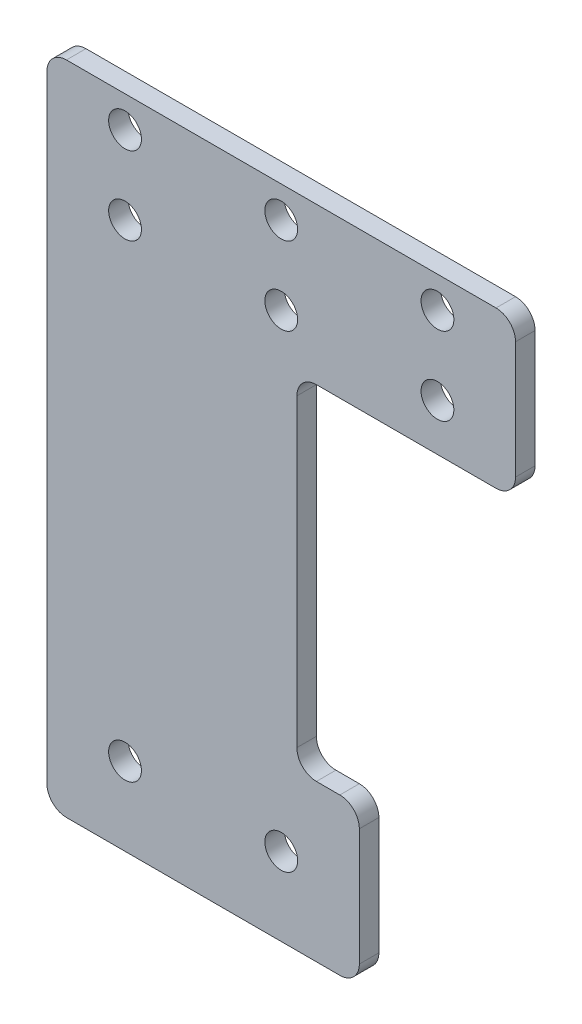
ISO-10303-21;
HEADER;
FILE_DESCRIPTION(('STEP AP214'),'2;1');
FILE_NAME('part.step','',(''),(''),'','','');
FILE_SCHEMA(('AUTOMOTIVE_DESIGN { 1 0 10303 214 1 1 1 1 }'));
ENDSEC;
DATA;
#1=APPLICATION_CONTEXT('core data for automotive mechanical design processes');
#2=APPLICATION_PROTOCOL_DEFINITION('international standard','automotive_design',2000,#1);
#3=PRODUCT_CONTEXT('',#1,'mechanical');
#4=PRODUCT('Part','Part','',(#3));
#5=PRODUCT_RELATED_PRODUCT_CATEGORY('part','',(#4));
#6=PRODUCT_DEFINITION_FORMATION('','',#4);
#7=PRODUCT_DEFINITION_CONTEXT('part definition',#1,'design');
#8=PRODUCT_DEFINITION('design','',#6,#7);
#9=PRODUCT_DEFINITION_SHAPE('','',#8);
#10=(LENGTH_UNIT() NAMED_UNIT(*) SI_UNIT(.MILLI.,.METRE.));
#11=(NAMED_UNIT(*) PLANE_ANGLE_UNIT() SI_UNIT($,.RADIAN.));
#12=(NAMED_UNIT(*) SI_UNIT($,.STERADIAN.) SOLID_ANGLE_UNIT());
#13=UNCERTAINTY_MEASURE_WITH_UNIT(LENGTH_MEASURE(1.E-05),#10,'distance_accuracy_value','');
#14=(GEOMETRIC_REPRESENTATION_CONTEXT(3) GLOBAL_UNCERTAINTY_ASSIGNED_CONTEXT((#13)) GLOBAL_UNIT_ASSIGNED_CONTEXT((#10,
#11,#12)) REPRESENTATION_CONTEXT('',''));
#15=CARTESIAN_POINT('',(0.,0.,0.));
#16=DIRECTION('',(0.,0.,1.));
#17=DIRECTION('',(1.,0.,0.));
#18=AXIS2_PLACEMENT_3D('',#15,#16,#17);
#19=CARTESIAN_POINT('',(0.,25.4,3.175));
#20=DIRECTION('',(0.,1.,0.));
#21=DIRECTION('',(0.,0.,1.));
#22=AXIS2_PLACEMENT_3D('',#19,#20,#21);
#23=PLANE('',#22);
#24=DIRECTION('',(1.,0.,0.));
#25=VECTOR('',#24,1.);
#26=CARTESIAN_POINT('',(0.,25.4,0.));
#27=LINE('',#26,#25);
#28=CARTESIAN_POINT('',(43.815,25.4,0.));
#29=VERTEX_POINT('',#28);
#30=CARTESIAN_POINT('',(47.625,25.4,0.));
#31=VERTEX_POINT('',#30);
#32=EDGE_CURVE('E162',#29,#31,#27,.T.);
#33=ORIENTED_EDGE('',*,*,#32,.F.);
#34=DIRECTION('',(0.,0.,-1.));
#35=VECTOR('',#34,1.);
#36=CARTESIAN_POINT('',(43.815,25.4,3.175));
#37=LINE('',#36,#35);
#38=CARTESIAN_POINT('',(43.815,25.4,3.175));
#39=VERTEX_POINT('',#38);
#40=EDGE_CURVE('E243',#29,#39,#37,.F.);
#41=ORIENTED_EDGE('',*,*,#40,.T.);
#42=DIRECTION('',(1.,0.,0.));
#43=VECTOR('',#42,1.);
#44=CARTESIAN_POINT('',(0.,25.4,3.175));
#45=LINE('',#44,#43);
#46=CARTESIAN_POINT('',(47.625,25.4,3.175));
#47=VERTEX_POINT('',#46);
#48=EDGE_CURVE('E316',#39,#47,#45,.T.);
#49=ORIENTED_EDGE('',*,*,#48,.T.);
#50=DIRECTION('',(0.,0.,-1.));
#51=VECTOR('',#50,1.);
#52=CARTESIAN_POINT('',(47.625,25.4,3.175));
#53=LINE('',#52,#51);
#54=EDGE_CURVE('E240',#47,#31,#53,.T.);
#55=ORIENTED_EDGE('',*,*,#54,.T.);
#56=EDGE_LOOP('',(#33,#41,#49,#55));
#57=FACE_BOUND('',#56,.T.);
#58=ADVANCED_FACE('F41',(#57),#23,.T.);
#59=CARTESIAN_POINT('',(40.64,0.,3.175));
#60=DIRECTION('',(1.,0.,0.));
#61=DIRECTION('',(0.,1.,0.));
#62=AXIS2_PLACEMENT_3D('',#59,#60,#61);
#63=PLANE('',#62);
#64=DIRECTION('',(0.,-1.,0.));
#65=VECTOR('',#64,1.);
#66=CARTESIAN_POINT('',(40.64,0.,3.175));
#67=LINE('',#66,#65);
#68=CARTESIAN_POINT('',(40.64,78.105,3.175));
#69=VERTEX_POINT('',#68);
#70=CARTESIAN_POINT('',(40.64,28.575,3.175));
#71=VERTEX_POINT('',#70);
#72=EDGE_CURVE('E304',#69,#71,#67,.T.);
#73=ORIENTED_EDGE('',*,*,#72,.T.);
#74=DIRECTION('',(0.,0.,-1.));
#75=VECTOR('',#74,1.);
#76=CARTESIAN_POINT('',(40.64,28.575,0.));
#77=LINE('',#76,#75);
#78=CARTESIAN_POINT('',(40.64,28.575,0.));
#79=VERTEX_POINT('',#78);
#80=EDGE_CURVE('E236',#71,#79,#77,.T.);
#81=ORIENTED_EDGE('',*,*,#80,.T.);
#82=DIRECTION('',(0.,-1.,0.));
#83=VECTOR('',#82,1.);
#84=CARTESIAN_POINT('',(40.64,0.,0.));
#85=LINE('',#84,#83);
#86=CARTESIAN_POINT('',(40.64,78.105,0.));
#87=VERTEX_POINT('',#86);
#88=EDGE_CURVE('E282',#87,#79,#85,.T.);
#89=ORIENTED_EDGE('',*,*,#88,.F.);
#90=DIRECTION('',(0.,0.,-1.));
#91=VECTOR('',#90,1.);
#92=CARTESIAN_POINT('',(40.64,78.105,3.175));
#93=LINE('',#92,#91);
#94=EDGE_CURVE('E233',#87,#69,#93,.F.);
#95=ORIENTED_EDGE('',*,*,#94,.T.);
#96=EDGE_LOOP('',(#73,#81,#89,#95));
#97=FACE_BOUND('',#96,.T.);
#98=ADVANCED_FACE('F290',(#97),#63,.T.);
#99=CARTESIAN_POINT('',(0.,81.28,3.175));
#100=DIRECTION('',(0.,-1.,0.));
#101=DIRECTION('',(0.,0.,-1.));
#102=AXIS2_PLACEMENT_3D('',#99,#100,#101);
#103=PLANE('',#102);
#104=DIRECTION('',(-1.,0.,0.));
#105=VECTOR('',#104,1.);
#106=CARTESIAN_POINT('',(0.,81.28,3.175));
#107=LINE('',#106,#105);
#108=CARTESIAN_POINT('',(73.025,81.28,3.175));
#109=VERTEX_POINT('',#108);
#110=CARTESIAN_POINT('',(43.815,81.28,3.175));
#111=VERTEX_POINT('',#110);
#112=EDGE_CURVE('E302',#109,#111,#107,.T.);
#113=ORIENTED_EDGE('',*,*,#112,.T.);
#114=DIRECTION('',(0.,0.,-1.));
#115=VECTOR('',#114,1.);
#116=CARTESIAN_POINT('',(43.815,81.28,0.));
#117=LINE('',#116,#115);
#118=CARTESIAN_POINT('',(43.815,81.28,0.));
#119=VERTEX_POINT('',#118);
#120=EDGE_CURVE('E249',#111,#119,#117,.T.);
#121=ORIENTED_EDGE('',*,*,#120,.T.);
#122=DIRECTION('',(-1.,0.,0.));
#123=VECTOR('',#122,1.);
#124=CARTESIAN_POINT('',(0.,81.28,0.));
#125=LINE('',#124,#123);
#126=CARTESIAN_POINT('',(73.025,81.28,0.));
#127=VERTEX_POINT('',#126);
#128=EDGE_CURVE('E284',#127,#119,#125,.T.);
#129=ORIENTED_EDGE('',*,*,#128,.F.);
#130=DIRECTION('',(0.,0.,-1.));
#131=VECTOR('',#130,1.);
#132=CARTESIAN_POINT('',(73.025,81.28,3.175));
#133=LINE('',#132,#131);
#134=EDGE_CURVE('E246',#127,#109,#133,.F.);
#135=ORIENTED_EDGE('',*,*,#134,.T.);
#136=EDGE_LOOP('',(#113,#121,#129,#135));
#137=FACE_BOUND('',#136,.T.);
#138=ADVANCED_FACE('F306',(#137),#103,.T.);
#139=CARTESIAN_POINT('',(76.2,0.,3.175));
#140=DIRECTION('',(1.,0.,0.));
#141=DIRECTION('',(0.,0.,-1.));
#142=AXIS2_PLACEMENT_3D('',#139,#140,#141);
#143=PLANE('',#142);
#144=DIRECTION('',(0.,-1.,0.));
#145=VECTOR('',#144,1.);
#146=CARTESIAN_POINT('',(76.2,0.,0.));
#147=LINE('',#146,#145);
#148=CARTESIAN_POINT('',(76.2,103.505,0.));
#149=VERTEX_POINT('',#148);
#150=CARTESIAN_POINT('',(76.2,84.455,0.));
#151=VERTEX_POINT('',#150);
#152=EDGE_CURVE('E364',#149,#151,#147,.T.);
#153=ORIENTED_EDGE('',*,*,#152,.F.);
#154=DIRECTION('',(0.,0.,-1.));
#155=VECTOR('',#154,1.);
#156=CARTESIAN_POINT('',(76.2,103.505,3.175));
#157=LINE('',#156,#155);
#158=CARTESIAN_POINT('',(76.2,103.505,3.175));
#159=VERTEX_POINT('',#158);
#160=EDGE_CURVE('E270',#149,#159,#157,.F.);
#161=ORIENTED_EDGE('',*,*,#160,.T.);
#162=DIRECTION('',(0.,-1.,0.));
#163=VECTOR('',#162,1.);
#164=CARTESIAN_POINT('',(76.2,0.,3.175));
#165=LINE('',#164,#163);
#166=CARTESIAN_POINT('',(76.2,84.455,3.175));
#167=VERTEX_POINT('',#166);
#168=EDGE_CURVE('E309',#159,#167,#165,.T.);
#169=ORIENTED_EDGE('',*,*,#168,.T.);
#170=DIRECTION('',(0.,0.,-1.));
#171=VECTOR('',#170,1.);
#172=CARTESIAN_POINT('',(76.2,84.455,3.175));
#173=LINE('',#172,#171);
#174=EDGE_CURVE('E266',#167,#151,#173,.T.);
#175=ORIENTED_EDGE('',*,*,#174,.T.);
#176=EDGE_LOOP('',(#153,#161,#169,#175));
#177=FACE_BOUND('',#176,.T.);
#178=ADVANCED_FACE('F463',(#177),#143,.T.);
#179=CARTESIAN_POINT('',(0.,106.68,3.175));
#180=DIRECTION('',(0.,1.,0.));
#181=DIRECTION('',(0.,0.,1.));
#182=AXIS2_PLACEMENT_3D('',#179,#180,#181);
#183=PLANE('',#182);
#184=DIRECTION('',(1.,0.,0.));
#185=VECTOR('',#184,1.);
#186=CARTESIAN_POINT('',(0.,106.68,0.));
#187=LINE('',#186,#185);
#188=CARTESIAN_POINT('',(3.175,106.68,0.));
#189=VERTEX_POINT('',#188);
#190=CARTESIAN_POINT('',(73.025,106.68,0.));
#191=VERTEX_POINT('',#190);
#192=EDGE_CURVE('E368',#189,#191,#187,.T.);
#193=ORIENTED_EDGE('',*,*,#192,.F.);
#194=DIRECTION('',(0.,0.,-1.));
#195=VECTOR('',#194,1.);
#196=CARTESIAN_POINT('',(3.175,106.68,3.175));
#197=LINE('',#196,#195);
#198=CARTESIAN_POINT('',(3.175,106.68,3.175));
#199=VERTEX_POINT('',#198);
#200=EDGE_CURVE('E263',#189,#199,#197,.F.);
#201=ORIENTED_EDGE('',*,*,#200,.T.);
#202=DIRECTION('',(1.,0.,0.));
#203=VECTOR('',#202,1.);
#204=CARTESIAN_POINT('',(0.,106.68,3.175));
#205=LINE('',#204,#203);
#206=CARTESIAN_POINT('',(73.025,106.68,3.175));
#207=VERTEX_POINT('',#206);
#208=EDGE_CURVE('E314',#199,#207,#205,.T.);
#209=ORIENTED_EDGE('',*,*,#208,.T.);
#210=DIRECTION('',(0.,0.,-1.));
#211=VECTOR('',#210,1.);
#212=CARTESIAN_POINT('',(73.025,106.68,3.175));
#213=LINE('',#212,#211);
#214=EDGE_CURVE('E259',#207,#191,#213,.T.);
#215=ORIENTED_EDGE('',*,*,#214,.T.);
#216=EDGE_LOOP('',(#193,#201,#209,#215));
#217=FACE_BOUND('',#216,.T.);
#218=ADVANCED_FACE('F457',(#217),#183,.T.);
#219=CARTESIAN_POINT('',(0.,0.,3.175));
#220=DIRECTION('',(-1.,0.,0.));
#221=DIRECTION('',(0.,0.,1.));
#222=AXIS2_PLACEMENT_3D('',#219,#220,#221);
#223=PLANE('',#222);
#224=DIRECTION('',(0.,1.,0.));
#225=VECTOR('',#224,1.);
#226=CARTESIAN_POINT('',(0.,0.,3.175));
#227=LINE('',#226,#225);
#228=CARTESIAN_POINT('',(0.,3.175,3.175));
#229=VERTEX_POINT('',#228);
#230=CARTESIAN_POINT('',(0.,103.505,3.175));
#231=VERTEX_POINT('',#230);
#232=EDGE_CURVE('E323',#229,#231,#227,.T.);
#233=ORIENTED_EDGE('',*,*,#232,.T.);
#234=DIRECTION('',(0.,0.,-1.));
#235=VECTOR('',#234,1.);
#236=CARTESIAN_POINT('',(0.,103.505,3.175));
#237=LINE('',#236,#235);
#238=CARTESIAN_POINT('',(0.,103.505,0.));
#239=VERTEX_POINT('',#238);
#240=EDGE_CURVE('E255',#231,#239,#237,.T.);
#241=ORIENTED_EDGE('',*,*,#240,.T.);
#242=DIRECTION('',(0.,1.,0.));
#243=VECTOR('',#242,1.);
#244=CARTESIAN_POINT('',(0.,0.,0.));
#245=LINE('',#244,#243);
#246=CARTESIAN_POINT('',(0.,3.175,0.));
#247=VERTEX_POINT('',#246);
#248=EDGE_CURVE('E372',#247,#239,#245,.T.);
#249=ORIENTED_EDGE('',*,*,#248,.F.);
#250=DIRECTION('',(0.,0.,-1.));
#251=VECTOR('',#250,1.);
#252=CARTESIAN_POINT('',(0.,3.175,3.175));
#253=LINE('',#252,#251);
#254=EDGE_CURVE('E64',#247,#229,#253,.F.);
#255=ORIENTED_EDGE('',*,*,#254,.T.);
#256=EDGE_LOOP('',(#233,#241,#249,#255));
#257=FACE_BOUND('',#256,.T.);
#258=ADVANCED_FACE('F460',(#257),#223,.T.);
#259=CARTESIAN_POINT('',(0.,0.,3.175));
#260=DIRECTION('',(0.,-1.,0.));
#261=DIRECTION('',(1.,0.,0.));
#262=AXIS2_PLACEMENT_3D('',#259,#260,#261);
#263=PLANE('',#262);
#264=DIRECTION('',(-1.,0.,0.));
#265=VECTOR('',#264,1.);
#266=CARTESIAN_POINT('',(0.,0.,0.));
#267=LINE('',#266,#265);
#268=CARTESIAN_POINT('',(47.625,0.,0.));
#269=VERTEX_POINT('',#268);
#270=CARTESIAN_POINT('',(3.175,0.,0.));
#271=VERTEX_POINT('',#270);
#272=EDGE_CURVE('E181',#269,#271,#267,.T.);
#273=ORIENTED_EDGE('',*,*,#272,.F.);
#274=DIRECTION('',(0.,0.,-1.));
#275=VECTOR('',#274,1.);
#276=CARTESIAN_POINT('',(47.625,0.,3.175));
#277=LINE('',#276,#275);
#278=CARTESIAN_POINT('',(47.625,0.,3.175));
#279=VERTEX_POINT('',#278);
#280=EDGE_CURVE('E214',#269,#279,#277,.F.);
#281=ORIENTED_EDGE('',*,*,#280,.T.);
#282=DIRECTION('',(-1.,0.,0.));
#283=VECTOR('',#282,1.);
#284=CARTESIAN_POINT('',(0.,0.,3.175));
#285=LINE('',#284,#283);
#286=CARTESIAN_POINT('',(3.175,0.,3.175));
#287=VERTEX_POINT('',#286);
#288=EDGE_CURVE('E326',#279,#287,#285,.T.);
#289=ORIENTED_EDGE('',*,*,#288,.T.);
#290=DIRECTION('',(0.,0.,-1.));
#291=VECTOR('',#290,1.);
#292=CARTESIAN_POINT('',(3.175,0.,3.175));
#293=LINE('',#292,#291);
#294=EDGE_CURVE('E210',#287,#271,#293,.T.);
#295=ORIENTED_EDGE('',*,*,#294,.T.);
#296=EDGE_LOOP('',(#273,#281,#289,#295));
#297=FACE_BOUND('',#296,.T.);
#298=ADVANCED_FACE('F381',(#297),#263,.T.);
#299=CARTESIAN_POINT('',(50.8,0.,3.175));
#300=DIRECTION('',(1.,0.,0.));
#301=DIRECTION('',(0.,1.,0.));
#302=AXIS2_PLACEMENT_3D('',#299,#300,#301);
#303=PLANE('',#302);
#304=DIRECTION('',(0.,-1.,0.));
#305=VECTOR('',#304,1.);
#306=CARTESIAN_POINT('',(50.8,0.,3.175));
#307=LINE('',#306,#305);
#308=CARTESIAN_POINT('',(50.8,22.225,3.175));
#309=VERTEX_POINT('',#308);
#310=CARTESIAN_POINT('',(50.8,3.175,3.175));
#311=VERTEX_POINT('',#310);
#312=EDGE_CURVE('E194',#309,#311,#307,.T.);
#313=ORIENTED_EDGE('',*,*,#312,.T.);
#314=DIRECTION('',(0.,0.,-1.));
#315=VECTOR('',#314,1.);
#316=CARTESIAN_POINT('',(50.8,3.175,3.175));
#317=LINE('',#316,#315);
#318=CARTESIAN_POINT('',(50.8,3.175,0.));
#319=VERTEX_POINT('',#318);
#320=EDGE_CURVE('E178',#311,#319,#317,.T.);
#321=ORIENTED_EDGE('',*,*,#320,.T.);
#322=DIRECTION('',(0.,-1.,0.));
#323=VECTOR('',#322,1.);
#324=CARTESIAN_POINT('',(50.8,0.,0.));
#325=LINE('',#324,#323);
#326=CARTESIAN_POINT('',(50.8,22.225,0.));
#327=VERTEX_POINT('',#326);
#328=EDGE_CURVE('E160',#327,#319,#325,.T.);
#329=ORIENTED_EDGE('',*,*,#328,.F.);
#330=DIRECTION('',(0.,0.,-1.));
#331=VECTOR('',#330,1.);
#332=CARTESIAN_POINT('',(50.8,22.225,3.175));
#333=LINE('',#332,#331);
#334=EDGE_CURVE('E175',#327,#309,#333,.F.);
#335=ORIENTED_EDGE('',*,*,#334,.T.);
#336=EDGE_LOOP('',(#313,#321,#329,#335));
#337=FACE_BOUND('',#336,.T.);
#338=ADVANCED_FACE('F174',(#337),#303,.T.);
#339=CARTESIAN_POINT('',(12.7,88.9,3.175));
#340=DIRECTION('',(0.,0.,-1.));
#341=DIRECTION('',(-1.,0.,0.));
#342=AXIS2_PLACEMENT_3D('',#339,#340,#341);
#343=CYLINDRICAL_SURFACE('',#342,2.667);
#344=CARTESIAN_POINT('',(12.7,88.9,3.175));
#345=DIRECTION('',(0.,0.,1.));
#346=DIRECTION('',(1.,0.,0.));
#347=AXIS2_PLACEMENT_3D('',#344,#345,#346);
#348=CIRCLE('',#347,2.667);
#349=CARTESIAN_POINT('',(15.367,88.9,3.175));
#350=VERTEX_POINT('',#349);
#351=EDGE_CURVE('E515',#350,#350,#348,.T.);
#352=ORIENTED_EDGE('',*,*,#351,.T.);
#353=EDGE_LOOP('',(#352));
#354=FACE_BOUND('',#353,.T.);
#355=CARTESIAN_POINT('',(12.7,88.9,0.));
#356=DIRECTION('',(0.,0.,1.));
#357=DIRECTION('',(1.,0.,0.));
#358=AXIS2_PLACEMENT_3D('',#355,#356,#357);
#359=CIRCLE('',#358,2.667);
#360=CARTESIAN_POINT('',(15.367,88.9,0.));
#361=VERTEX_POINT('',#360);
#362=EDGE_CURVE('E356',#361,#361,#359,.T.);
#363=ORIENTED_EDGE('',*,*,#362,.F.);
#364=EDGE_LOOP('',(#363));
#365=FACE_BOUND('',#364,.T.);
#366=ADVANCED_FACE('F404',(#354,#365),#343,.F.);
#367=CARTESIAN_POINT('',(38.1,88.9,3.175));
#368=DIRECTION('',(0.,0.,-1.));
#369=DIRECTION('',(-1.,0.,0.));
#370=AXIS2_PLACEMENT_3D('',#367,#368,#369);
#371=CYLINDRICAL_SURFACE('',#370,2.667);
#372=CARTESIAN_POINT('',(38.1,88.9,3.175));
#373=DIRECTION('',(0.,0.,1.));
#374=DIRECTION('',(1.,0.,0.));
#375=AXIS2_PLACEMENT_3D('',#372,#373,#374);
#376=CIRCLE('',#375,2.667);
#377=CARTESIAN_POINT('',(40.767,88.9,3.175));
#378=VERTEX_POINT('',#377);
#379=EDGE_CURVE('E512',#378,#378,#376,.T.);
#380=ORIENTED_EDGE('',*,*,#379,.T.);
#381=EDGE_LOOP('',(#380));
#382=FACE_BOUND('',#381,.T.);
#383=CARTESIAN_POINT('',(38.1,88.9,0.));
#384=DIRECTION('',(0.,0.,1.));
#385=DIRECTION('',(1.,0.,0.));
#386=AXIS2_PLACEMENT_3D('',#383,#384,#385);
#387=CIRCLE('',#386,2.667);
#388=CARTESIAN_POINT('',(40.767,88.9,0.));
#389=VERTEX_POINT('',#388);
#390=EDGE_CURVE('E352',#389,#389,#387,.T.);
#391=ORIENTED_EDGE('',*,*,#390,.F.);
#392=EDGE_LOOP('',(#391));
#393=FACE_BOUND('',#392,.T.);
#394=ADVANCED_FACE('F407',(#382,#393),#371,.F.);
#395=CARTESIAN_POINT('',(63.5,88.9,3.175));
#396=DIRECTION('',(0.,0.,-1.));
#397=DIRECTION('',(-1.,0.,0.));
#398=AXIS2_PLACEMENT_3D('',#395,#396,#397);
#399=CYLINDRICAL_SURFACE('',#398,2.667);
#400=CARTESIAN_POINT('',(63.5,88.9,3.175));
#401=DIRECTION('',(0.,0.,1.));
#402=DIRECTION('',(1.,0.,0.));
#403=AXIS2_PLACEMENT_3D('',#400,#401,#402);
#404=CIRCLE('',#403,2.667);
#405=CARTESIAN_POINT('',(66.167,88.9,3.175));
#406=VERTEX_POINT('',#405);
#407=EDGE_CURVE('E508',#406,#406,#404,.T.);
#408=ORIENTED_EDGE('',*,*,#407,.T.);
#409=EDGE_LOOP('',(#408));
#410=FACE_BOUND('',#409,.T.);
#411=CARTESIAN_POINT('',(63.5,88.9,0.));
#412=DIRECTION('',(0.,0.,1.));
#413=DIRECTION('',(1.,0.,0.));
#414=AXIS2_PLACEMENT_3D('',#411,#412,#413);
#415=CIRCLE('',#414,2.667);
#416=CARTESIAN_POINT('',(66.167,88.9,0.));
#417=VERTEX_POINT('',#416);
#418=EDGE_CURVE('E348',#417,#417,#415,.T.);
#419=ORIENTED_EDGE('',*,*,#418,.F.);
#420=EDGE_LOOP('',(#419));
#421=FACE_BOUND('',#420,.T.);
#422=ADVANCED_FACE('F411',(#410,#421),#399,.F.);
#423=CARTESIAN_POINT('',(38.1,101.6,3.175));
#424=DIRECTION('',(0.,0.,-1.));
#425=DIRECTION('',(-1.,0.,0.));
#426=AXIS2_PLACEMENT_3D('',#423,#424,#425);
#427=CYLINDRICAL_SURFACE('',#426,2.667);
#428=CARTESIAN_POINT('',(38.1,101.6,3.175));
#429=DIRECTION('',(0.,0.,1.));
#430=DIRECTION('',(1.,0.,0.));
#431=AXIS2_PLACEMENT_3D('',#428,#429,#430);
#432=CIRCLE('',#431,2.667);
#433=CARTESIAN_POINT('',(40.767,101.6,3.175));
#434=VERTEX_POINT('',#433);
#435=EDGE_CURVE('E504',#434,#434,#432,.T.);
#436=ORIENTED_EDGE('',*,*,#435,.T.);
#437=EDGE_LOOP('',(#436));
#438=FACE_BOUND('',#437,.T.);
#439=CARTESIAN_POINT('',(38.1,101.6,0.));
#440=DIRECTION('',(0.,0.,1.));
#441=DIRECTION('',(1.,0.,0.));
#442=AXIS2_PLACEMENT_3D('',#439,#440,#441);
#443=CIRCLE('',#442,2.667);
#444=CARTESIAN_POINT('',(40.767,101.6,0.));
#445=VERTEX_POINT('',#444);
#446=EDGE_CURVE('E344',#445,#445,#443,.T.);
#447=ORIENTED_EDGE('',*,*,#446,.F.);
#448=EDGE_LOOP('',(#447));
#449=FACE_BOUND('',#448,.T.);
#450=ADVANCED_FACE('F415',(#438,#449),#427,.F.);
#451=CARTESIAN_POINT('',(63.5,101.6,3.175));
#452=DIRECTION('',(0.,0.,-1.));
#453=DIRECTION('',(-1.,0.,0.));
#454=AXIS2_PLACEMENT_3D('',#451,#452,#453);
#455=CYLINDRICAL_SURFACE('',#454,2.667);
#456=CARTESIAN_POINT('',(63.5,101.6,3.175));
#457=DIRECTION('',(0.,0.,1.));
#458=DIRECTION('',(1.,0.,0.));
#459=AXIS2_PLACEMENT_3D('',#456,#457,#458);
#460=CIRCLE('',#459,2.667);
#461=CARTESIAN_POINT('',(66.167,101.6,3.175));
#462=VERTEX_POINT('',#461);
#463=EDGE_CURVE('E500',#462,#462,#460,.T.);
#464=ORIENTED_EDGE('',*,*,#463,.T.);
#465=EDGE_LOOP('',(#464));
#466=FACE_BOUND('',#465,.T.);
#467=CARTESIAN_POINT('',(63.5,101.6,0.));
#468=DIRECTION('',(0.,0.,1.));
#469=DIRECTION('',(1.,0.,0.));
#470=AXIS2_PLACEMENT_3D('',#467,#468,#469);
#471=CIRCLE('',#470,2.667);
#472=CARTESIAN_POINT('',(66.167,101.6,0.));
#473=VERTEX_POINT('',#472);
#474=EDGE_CURVE('E340',#473,#473,#471,.T.);
#475=ORIENTED_EDGE('',*,*,#474,.F.);
#476=EDGE_LOOP('',(#475));
#477=FACE_BOUND('',#476,.T.);
#478=ADVANCED_FACE('F419',(#466,#477),#455,.F.);
#479=CARTESIAN_POINT('',(12.7,101.6,3.175));
#480=DIRECTION('',(0.,0.,-1.));
#481=DIRECTION('',(-1.,0.,0.));
#482=AXIS2_PLACEMENT_3D('',#479,#480,#481);
#483=CYLINDRICAL_SURFACE('',#482,2.667);
#484=CARTESIAN_POINT('',(12.7,101.6,3.175));
#485=DIRECTION('',(0.,0.,1.));
#486=DIRECTION('',(1.,0.,0.));
#487=AXIS2_PLACEMENT_3D('',#484,#485,#486);
#488=CIRCLE('',#487,2.667);
#489=CARTESIAN_POINT('',(15.367,101.6,3.175));
#490=VERTEX_POINT('',#489);
#491=EDGE_CURVE('E496',#490,#490,#488,.T.);
#492=ORIENTED_EDGE('',*,*,#491,.T.);
#493=EDGE_LOOP('',(#492));
#494=FACE_BOUND('',#493,.T.);
#495=CARTESIAN_POINT('',(12.7,101.6,0.));
#496=DIRECTION('',(0.,0.,1.));
#497=DIRECTION('',(1.,0.,0.));
#498=AXIS2_PLACEMENT_3D('',#495,#496,#497);
#499=CIRCLE('',#498,2.667);
#500=CARTESIAN_POINT('',(15.367,101.6,0.));
#501=VERTEX_POINT('',#500);
#502=EDGE_CURVE('E336',#501,#501,#499,.T.);
#503=ORIENTED_EDGE('',*,*,#502,.F.);
#504=EDGE_LOOP('',(#503));
#505=FACE_BOUND('',#504,.T.);
#506=ADVANCED_FACE('F423',(#494,#505),#483,.F.);
#507=CARTESIAN_POINT('',(38.1,12.7,3.175));
#508=DIRECTION('',(0.,0.,-1.));
#509=DIRECTION('',(-1.,0.,0.));
#510=AXIS2_PLACEMENT_3D('',#507,#508,#509);
#511=CYLINDRICAL_SURFACE('',#510,2.667);
#512=CARTESIAN_POINT('',(38.1,12.7,3.175));
#513=DIRECTION('',(0.,0.,1.));
#514=DIRECTION('',(1.,0.,0.));
#515=AXIS2_PLACEMENT_3D('',#512,#513,#514);
#516=CIRCLE('',#515,2.667);
#517=CARTESIAN_POINT('',(40.767,12.7,3.175));
#518=VERTEX_POINT('',#517);
#519=EDGE_CURVE('E492',#518,#518,#516,.T.);
#520=ORIENTED_EDGE('',*,*,#519,.T.);
#521=EDGE_LOOP('',(#520));
#522=FACE_BOUND('',#521,.T.);
#523=CARTESIAN_POINT('',(38.1,12.7,0.));
#524=DIRECTION('',(0.,0.,1.));
#525=DIRECTION('',(1.,0.,0.));
#526=AXIS2_PLACEMENT_3D('',#523,#524,#525);
#527=CIRCLE('',#526,2.667);
#528=CARTESIAN_POINT('',(40.767,12.7,0.));
#529=VERTEX_POINT('',#528);
#530=EDGE_CURVE('E332',#529,#529,#527,.T.);
#531=ORIENTED_EDGE('',*,*,#530,.F.);
#532=EDGE_LOOP('',(#531));
#533=FACE_BOUND('',#532,.T.);
#534=ADVANCED_FACE('F427',(#522,#533),#511,.F.);
#535=CARTESIAN_POINT('',(12.7,12.7,3.175));
#536=DIRECTION('',(0.,0.,-1.));
#537=DIRECTION('',(-1.,0.,0.));
#538=AXIS2_PLACEMENT_3D('',#535,#536,#537);
#539=CYLINDRICAL_SURFACE('',#538,2.667);
#540=CARTESIAN_POINT('',(12.7,12.7,3.175));
#541=DIRECTION('',(0.,0.,1.));
#542=DIRECTION('',(1.,0.,0.));
#543=AXIS2_PLACEMENT_3D('',#540,#541,#542);
#544=CIRCLE('',#543,2.667);
#545=CARTESIAN_POINT('',(15.367,12.7,3.175));
#546=VERTEX_POINT('',#545);
#547=EDGE_CURVE('E187',#546,#546,#544,.T.);
#548=ORIENTED_EDGE('',*,*,#547,.T.);
#549=EDGE_LOOP('',(#548));
#550=FACE_BOUND('',#549,.T.);
#551=CARTESIAN_POINT('',(12.7,12.7,0.));
#552=DIRECTION('',(0.,0.,1.));
#553=DIRECTION('',(1.,0.,0.));
#554=AXIS2_PLACEMENT_3D('',#551,#552,#553);
#555=CIRCLE('',#554,2.667);
#556=CARTESIAN_POINT('',(15.367,12.7,0.));
#557=VERTEX_POINT('',#556);
#558=EDGE_CURVE('E180',#557,#557,#555,.T.);
#559=ORIENTED_EDGE('',*,*,#558,.F.);
#560=EDGE_LOOP('',(#559));
#561=FACE_BOUND('',#560,.T.);
#562=ADVANCED_FACE('F431',(#550,#561),#539,.F.);
#563=CARTESIAN_POINT('',(0.,0.,3.175));
#564=DIRECTION('',(0.,0.,1.));
#565=DIRECTION('',(1.,0.,0.));
#566=AXIS2_PLACEMENT_3D('',#563,#564,#565);
#567=PLANE('',#566);
#568=ORIENTED_EDGE('',*,*,#519,.F.);
#569=EDGE_LOOP('',(#568));
#570=FACE_BOUND('',#569,.T.);
#571=ORIENTED_EDGE('',*,*,#491,.F.);
#572=EDGE_LOOP('',(#571));
#573=FACE_BOUND('',#572,.T.);
#574=ORIENTED_EDGE('',*,*,#463,.F.);
#575=EDGE_LOOP('',(#574));
#576=FACE_BOUND('',#575,.T.);
#577=ORIENTED_EDGE('',*,*,#435,.F.);
#578=EDGE_LOOP('',(#577));
#579=FACE_BOUND('',#578,.T.);
#580=ORIENTED_EDGE('',*,*,#407,.F.);
#581=EDGE_LOOP('',(#580));
#582=FACE_BOUND('',#581,.T.);
#583=ORIENTED_EDGE('',*,*,#379,.F.);
#584=EDGE_LOOP('',(#583));
#585=FACE_BOUND('',#584,.T.);
#586=ORIENTED_EDGE('',*,*,#351,.F.);
#587=EDGE_LOOP('',(#586));
#588=FACE_BOUND('',#587,.T.);
#589=ORIENTED_EDGE('',*,*,#288,.F.);
#590=CARTESIAN_POINT('',(47.625,3.175,3.175));
#591=DIRECTION('',(0.,0.,1.));
#592=DIRECTION('',(1.,0.,0.));
#593=AXIS2_PLACEMENT_3D('',#590,#591,#592);
#594=CIRCLE('',#593,3.175);
#595=EDGE_CURVE('E230',#279,#311,#594,.T.);
#596=ORIENTED_EDGE('',*,*,#595,.T.);
#597=ORIENTED_EDGE('',*,*,#312,.F.);
#598=CARTESIAN_POINT('',(47.625,22.225,3.175));
#599=DIRECTION('',(0.,0.,1.));
#600=DIRECTION('',(1.,0.,0.));
#601=AXIS2_PLACEMENT_3D('',#598,#599,#600);
#602=CIRCLE('',#601,3.175);
#603=EDGE_CURVE('E185',#309,#47,#602,.T.);
#604=ORIENTED_EDGE('',*,*,#603,.T.);
#605=ORIENTED_EDGE('',*,*,#48,.F.);
#606=CARTESIAN_POINT('',(43.815,28.575,3.175));
#607=DIRECTION('',(0.,0.,1.));
#608=DIRECTION('',(1.,0.,0.));
#609=AXIS2_PLACEMENT_3D('',#606,#607,#608);
#610=CIRCLE('',#609,3.175);
#611=EDGE_CURVE('E276',#39,#71,#610,.F.);
#612=ORIENTED_EDGE('',*,*,#611,.T.);
#613=ORIENTED_EDGE('',*,*,#72,.F.);
#614=CARTESIAN_POINT('',(43.815,78.105,3.175));
#615=DIRECTION('',(0.,0.,1.));
#616=DIRECTION('',(1.,0.,0.));
#617=AXIS2_PLACEMENT_3D('',#614,#615,#616);
#618=CIRCLE('',#617,3.175);
#619=EDGE_CURVE('E11',#69,#111,#618,.F.);
#620=ORIENTED_EDGE('',*,*,#619,.T.);
#621=ORIENTED_EDGE('',*,*,#112,.F.);
#622=CARTESIAN_POINT('',(73.025,84.455,3.175));
#623=DIRECTION('',(0.,0.,1.));
#624=DIRECTION('',(1.,0.,0.));
#625=AXIS2_PLACEMENT_3D('',#622,#623,#624);
#626=CIRCLE('',#625,3.175);
#627=EDGE_CURVE('E220',#109,#167,#626,.T.);
#628=ORIENTED_EDGE('',*,*,#627,.T.);
#629=ORIENTED_EDGE('',*,*,#168,.F.);
#630=CARTESIAN_POINT('',(73.025,103.505,3.175));
#631=DIRECTION('',(0.,0.,1.));
#632=DIRECTION('',(1.,0.,0.));
#633=AXIS2_PLACEMENT_3D('',#630,#631,#632);
#634=CIRCLE('',#633,3.175);
#635=EDGE_CURVE('E223',#159,#207,#634,.T.);
#636=ORIENTED_EDGE('',*,*,#635,.T.);
#637=ORIENTED_EDGE('',*,*,#208,.F.);
#638=CARTESIAN_POINT('',(3.175,103.505,3.175));
#639=DIRECTION('',(0.,0.,1.));
#640=DIRECTION('',(1.,0.,0.));
#641=AXIS2_PLACEMENT_3D('',#638,#639,#640);
#642=CIRCLE('',#641,3.175);
#643=EDGE_CURVE('E57',#199,#231,#642,.T.);
#644=ORIENTED_EDGE('',*,*,#643,.T.);
#645=ORIENTED_EDGE('',*,*,#232,.F.);
#646=CARTESIAN_POINT('',(3.175,3.175,3.175));
#647=DIRECTION('',(0.,0.,1.));
#648=DIRECTION('',(1.,0.,0.));
#649=AXIS2_PLACEMENT_3D('',#646,#647,#648);
#650=CIRCLE('',#649,3.175);
#651=EDGE_CURVE('E217',#229,#287,#650,.T.);
#652=ORIENTED_EDGE('',*,*,#651,.T.);
#653=EDGE_LOOP('',(#589,#596,#597,#604,#605,#612,#613,#620,#621,#628,#629,#636,#637,#644,#645,#652));
#654=FACE_BOUND('',#653,.T.);
#655=ORIENTED_EDGE('',*,*,#547,.F.);
#656=EDGE_LOOP('',(#655));
#657=FACE_BOUND('',#656,.T.);
#658=ADVANCED_FACE('F300',(#570,#573,#576,#579,#582,#585,#588,#654,#657),#567,.T.);
#659=CARTESIAN_POINT('',(0.,0.,0.));
#660=DIRECTION('',(0.,0.,1.));
#661=DIRECTION('',(1.,0.,0.));
#662=AXIS2_PLACEMENT_3D('',#659,#660,#661);
#663=PLANE('',#662);
#664=ORIENTED_EDGE('',*,*,#530,.T.);
#665=EDGE_LOOP('',(#664));
#666=FACE_BOUND('',#665,.T.);
#667=ORIENTED_EDGE('',*,*,#502,.T.);
#668=EDGE_LOOP('',(#667));
#669=FACE_BOUND('',#668,.T.);
#670=ORIENTED_EDGE('',*,*,#474,.T.);
#671=EDGE_LOOP('',(#670));
#672=FACE_BOUND('',#671,.T.);
#673=ORIENTED_EDGE('',*,*,#446,.T.);
#674=EDGE_LOOP('',(#673));
#675=FACE_BOUND('',#674,.T.);
#676=ORIENTED_EDGE('',*,*,#418,.T.);
#677=EDGE_LOOP('',(#676));
#678=FACE_BOUND('',#677,.T.);
#679=ORIENTED_EDGE('',*,*,#390,.T.);
#680=EDGE_LOOP('',(#679));
#681=FACE_BOUND('',#680,.T.);
#682=ORIENTED_EDGE('',*,*,#362,.T.);
#683=EDGE_LOOP('',(#682));
#684=FACE_BOUND('',#683,.T.);
#685=ORIENTED_EDGE('',*,*,#328,.T.);
#686=CARTESIAN_POINT('',(47.625,3.175,0.));
#687=DIRECTION('',(0.,0.,1.));
#688=DIRECTION('',(1.,0.,0.));
#689=AXIS2_PLACEMENT_3D('',#686,#687,#688);
#690=CIRCLE('',#689,3.175);
#691=EDGE_CURVE('E168',#319,#269,#690,.F.);
#692=ORIENTED_EDGE('',*,*,#691,.T.);
#693=ORIENTED_EDGE('',*,*,#272,.T.);
#694=CARTESIAN_POINT('',(3.175,3.175,0.));
#695=DIRECTION('',(0.,0.,1.));
#696=DIRECTION('',(1.,0.,0.));
#697=AXIS2_PLACEMENT_3D('',#694,#695,#696);
#698=CIRCLE('',#697,3.175);
#699=EDGE_CURVE('E191',#271,#247,#698,.F.);
#700=ORIENTED_EDGE('',*,*,#699,.T.);
#701=ORIENTED_EDGE('',*,*,#248,.T.);
#702=CARTESIAN_POINT('',(3.175,103.505,0.));
#703=DIRECTION('',(0.,0.,1.));
#704=DIRECTION('',(1.,0.,0.));
#705=AXIS2_PLACEMENT_3D('',#702,#703,#704);
#706=CIRCLE('',#705,3.175);
#707=EDGE_CURVE('E169',#239,#189,#706,.F.);
#708=ORIENTED_EDGE('',*,*,#707,.T.);
#709=ORIENTED_EDGE('',*,*,#192,.T.);
#710=CARTESIAN_POINT('',(73.025,103.505,0.));
#711=DIRECTION('',(0.,0.,1.));
#712=DIRECTION('',(1.,0.,0.));
#713=AXIS2_PLACEMENT_3D('',#710,#711,#712);
#714=CIRCLE('',#713,3.175);
#715=EDGE_CURVE('E203',#191,#149,#714,.F.);
#716=ORIENTED_EDGE('',*,*,#715,.T.);
#717=ORIENTED_EDGE('',*,*,#152,.T.);
#718=CARTESIAN_POINT('',(73.025,84.455,0.));
#719=DIRECTION('',(0.,0.,1.));
#720=DIRECTION('',(1.,0.,0.));
#721=AXIS2_PLACEMENT_3D('',#718,#719,#720);
#722=CIRCLE('',#721,3.175);
#723=EDGE_CURVE('E200',#151,#127,#722,.F.);
#724=ORIENTED_EDGE('',*,*,#723,.T.);
#725=ORIENTED_EDGE('',*,*,#128,.T.);
#726=CARTESIAN_POINT('',(43.815,78.105,0.));
#727=DIRECTION('',(0.,0.,1.));
#728=DIRECTION('',(1.,0.,0.));
#729=AXIS2_PLACEMENT_3D('',#726,#727,#728);
#730=CIRCLE('',#729,3.175);
#731=EDGE_CURVE('E50',#119,#87,#730,.T.);
#732=ORIENTED_EDGE('',*,*,#731,.T.);
#733=ORIENTED_EDGE('',*,*,#88,.T.);
#734=CARTESIAN_POINT('',(43.815,28.575,0.));
#735=DIRECTION('',(0.,0.,1.));
#736=DIRECTION('',(1.,0.,0.));
#737=AXIS2_PLACEMENT_3D('',#734,#735,#736);
#738=CIRCLE('',#737,3.175);
#739=EDGE_CURVE('E273',#79,#29,#738,.T.);
#740=ORIENTED_EDGE('',*,*,#739,.T.);
#741=ORIENTED_EDGE('',*,*,#32,.T.);
#742=CARTESIAN_POINT('',(47.625,22.225,0.));
#743=DIRECTION('',(0.,0.,1.));
#744=DIRECTION('',(1.,0.,0.));
#745=AXIS2_PLACEMENT_3D('',#742,#743,#744);
#746=CIRCLE('',#745,3.175);
#747=EDGE_CURVE('E156',#31,#327,#746,.F.);
#748=ORIENTED_EDGE('',*,*,#747,.T.);
#749=EDGE_LOOP('',(#685,#692,#693,#700,#701,#708,#709,#716,#717,#724,#725,#732,#733,#740,#741,#748));
#750=FACE_BOUND('',#749,.T.);
#751=ORIENTED_EDGE('',*,*,#558,.T.);
#752=EDGE_LOOP('',(#751));
#753=FACE_BOUND('',#752,.T.);
#754=ADVANCED_FACE('F158',(#666,#669,#672,#675,#678,#681,#684,#750,#753),#663,.F.);
#755=CARTESIAN_POINT('',(47.625,3.175,3.175));
#756=DIRECTION('',(0.,0.,-1.));
#757=DIRECTION('',(-1.,0.,0.));
#758=AXIS2_PLACEMENT_3D('',#755,#756,#757);
#759=CYLINDRICAL_SURFACE('',#758,3.175);
#760=ORIENTED_EDGE('',*,*,#595,.F.);
#761=ORIENTED_EDGE('',*,*,#280,.F.);
#762=ORIENTED_EDGE('',*,*,#691,.F.);
#763=ORIENTED_EDGE('',*,*,#320,.F.);
#764=EDGE_LOOP('',(#760,#761,#762,#763));
#765=FACE_BOUND('',#764,.T.);
#766=ADVANCED_FACE('F385',(#765),#759,.T.);
#767=CARTESIAN_POINT('',(43.815,28.575,3.175));
#768=DIRECTION('',(0.,0.,1.));
#769=DIRECTION('',(1.,0.,0.));
#770=AXIS2_PLACEMENT_3D('',#767,#768,#769);
#771=CYLINDRICAL_SURFACE('',#770,3.175);
#772=ORIENTED_EDGE('',*,*,#611,.F.);
#773=ORIENTED_EDGE('',*,*,#40,.F.);
#774=ORIENTED_EDGE('',*,*,#739,.F.);
#775=ORIENTED_EDGE('',*,*,#80,.F.);
#776=EDGE_LOOP('',(#772,#773,#774,#775));
#777=FACE_BOUND('',#776,.T.);
#778=ADVANCED_FACE('F435',(#777),#771,.F.);
#779=CARTESIAN_POINT('',(47.625,22.225,3.175));
#780=DIRECTION('',(0.,0.,-1.));
#781=DIRECTION('',(-1.,0.,0.));
#782=AXIS2_PLACEMENT_3D('',#779,#780,#781);
#783=CYLINDRICAL_SURFACE('',#782,3.175);
#784=ORIENTED_EDGE('',*,*,#603,.F.);
#785=ORIENTED_EDGE('',*,*,#334,.F.);
#786=ORIENTED_EDGE('',*,*,#747,.F.);
#787=ORIENTED_EDGE('',*,*,#54,.F.);
#788=EDGE_LOOP('',(#784,#785,#786,#787));
#789=FACE_BOUND('',#788,.T.);
#790=ADVANCED_FACE('F184',(#789),#783,.T.);
#791=CARTESIAN_POINT('',(43.815,78.105,3.175));
#792=DIRECTION('',(0.,0.,1.));
#793=DIRECTION('',(1.,0.,0.));
#794=AXIS2_PLACEMENT_3D('',#791,#792,#793);
#795=CYLINDRICAL_SURFACE('',#794,3.175);
#796=ORIENTED_EDGE('',*,*,#619,.F.);
#797=ORIENTED_EDGE('',*,*,#94,.F.);
#798=ORIENTED_EDGE('',*,*,#731,.F.);
#799=ORIENTED_EDGE('',*,*,#120,.F.);
#800=EDGE_LOOP('',(#796,#797,#798,#799));
#801=FACE_BOUND('',#800,.T.);
#802=ADVANCED_FACE('F296',(#801),#795,.F.);
#803=CARTESIAN_POINT('',(3.175,103.505,3.175));
#804=DIRECTION('',(0.,0.,-1.));
#805=DIRECTION('',(-1.,0.,0.));
#806=AXIS2_PLACEMENT_3D('',#803,#804,#805);
#807=CYLINDRICAL_SURFACE('',#806,3.175);
#808=ORIENTED_EDGE('',*,*,#643,.F.);
#809=ORIENTED_EDGE('',*,*,#200,.F.);
#810=ORIENTED_EDGE('',*,*,#707,.F.);
#811=ORIENTED_EDGE('',*,*,#240,.F.);
#812=EDGE_LOOP('',(#808,#809,#810,#811));
#813=FACE_BOUND('',#812,.T.);
#814=ADVANCED_FACE('F443',(#813),#807,.T.);
#815=CARTESIAN_POINT('',(73.025,103.505,3.175));
#816=DIRECTION('',(0.,0.,-1.));
#817=DIRECTION('',(-1.,0.,0.));
#818=AXIS2_PLACEMENT_3D('',#815,#816,#817);
#819=CYLINDRICAL_SURFACE('',#818,3.175);
#820=ORIENTED_EDGE('',*,*,#635,.F.);
#821=ORIENTED_EDGE('',*,*,#160,.F.);
#822=ORIENTED_EDGE('',*,*,#715,.F.);
#823=ORIENTED_EDGE('',*,*,#214,.F.);
#824=EDGE_LOOP('',(#820,#821,#822,#823));
#825=FACE_BOUND('',#824,.T.);
#826=ADVANCED_FACE('F393',(#825),#819,.T.);
#827=CARTESIAN_POINT('',(73.025,84.455,3.175));
#828=DIRECTION('',(0.,0.,-1.));
#829=DIRECTION('',(-1.,0.,0.));
#830=AXIS2_PLACEMENT_3D('',#827,#828,#829);
#831=CYLINDRICAL_SURFACE('',#830,3.175);
#832=ORIENTED_EDGE('',*,*,#627,.F.);
#833=ORIENTED_EDGE('',*,*,#134,.F.);
#834=ORIENTED_EDGE('',*,*,#723,.F.);
#835=ORIENTED_EDGE('',*,*,#174,.F.);
#836=EDGE_LOOP('',(#832,#833,#834,#835));
#837=FACE_BOUND('',#836,.T.);
#838=ADVANCED_FACE('F389',(#837),#831,.T.);
#839=CARTESIAN_POINT('',(3.175,3.175,3.175));
#840=DIRECTION('',(0.,0.,-1.));
#841=DIRECTION('',(-1.,0.,0.));
#842=AXIS2_PLACEMENT_3D('',#839,#840,#841);
#843=CYLINDRICAL_SURFACE('',#842,3.175);
#844=ORIENTED_EDGE('',*,*,#651,.F.);
#845=ORIENTED_EDGE('',*,*,#254,.F.);
#846=ORIENTED_EDGE('',*,*,#699,.F.);
#847=ORIENTED_EDGE('',*,*,#294,.F.);
#848=EDGE_LOOP('',(#844,#845,#846,#847));
#849=FACE_BOUND('',#848,.T.);
#850=ADVANCED_FACE('F43',(#849),#843,.T.);
#851=CLOSED_SHELL('',(#58,#98,#138,#178,#218,#258,#298,#338,#366,#394,#422,#450,#478,#506,#534,
#562,#658,#754,#766,#778,#790,#802,#814,#826,#838,#850));
#852=MANIFOLD_SOLID_BREP('B2',#851);
#853=ADVANCED_BREP_SHAPE_REPRESENTATION('',(#18,#852),#14);
#854=SHAPE_DEFINITION_REPRESENTATION(#9,#853);
ENDSEC;
END-ISO-10303-21;
